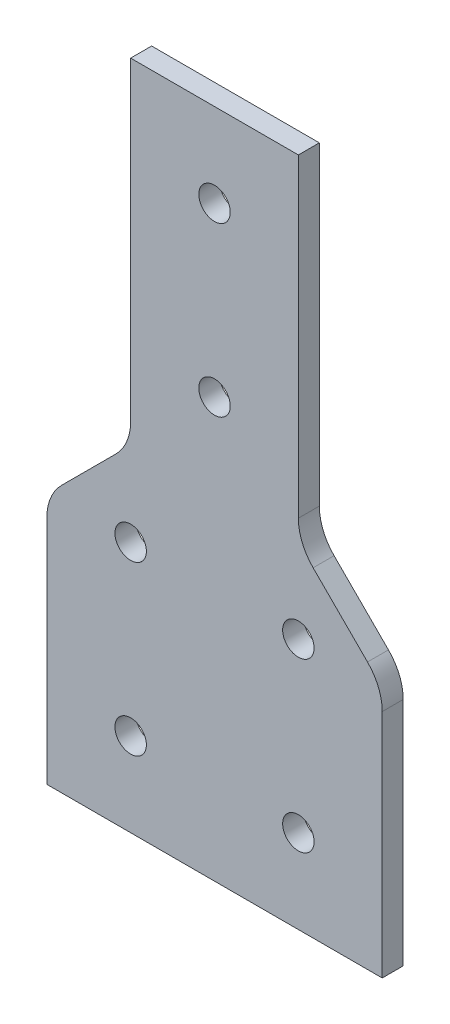
ISO-10303-21;
HEADER;
FILE_DESCRIPTION(('STEP AP214'),'2;1');
FILE_NAME('part.step','',(''),(''),'','','');
FILE_SCHEMA(('AUTOMOTIVE_DESIGN { 1 0 10303 214 1 1 1 1 }'));
ENDSEC;
DATA;
#1=APPLICATION_CONTEXT('core data for automotive mechanical design processes');
#2=APPLICATION_PROTOCOL_DEFINITION('international standard','automotive_design',2000,#1);
#3=PRODUCT_CONTEXT('',#1,'mechanical');
#4=PRODUCT('Part','Part','',(#3));
#5=PRODUCT_RELATED_PRODUCT_CATEGORY('part','',(#4));
#6=PRODUCT_DEFINITION_FORMATION('','',#4);
#7=PRODUCT_DEFINITION_CONTEXT('part definition',#1,'design');
#8=PRODUCT_DEFINITION('design','',#6,#7);
#9=PRODUCT_DEFINITION_SHAPE('','',#8);
#10=(LENGTH_UNIT() NAMED_UNIT(*) SI_UNIT(.MILLI.,.METRE.));
#11=(NAMED_UNIT(*) PLANE_ANGLE_UNIT() SI_UNIT($,.RADIAN.));
#12=(NAMED_UNIT(*) SI_UNIT($,.STERADIAN.) SOLID_ANGLE_UNIT());
#13=UNCERTAINTY_MEASURE_WITH_UNIT(LENGTH_MEASURE(1.E-05),#10,'distance_accuracy_value','');
#14=(GEOMETRIC_REPRESENTATION_CONTEXT(3) GLOBAL_UNCERTAINTY_ASSIGNED_CONTEXT((#13)) GLOBAL_UNIT_ASSIGNED_CONTEXT((#10,
#11,#12)) REPRESENTATION_CONTEXT('',''));
#15=CARTESIAN_POINT('',(0.,0.,0.));
#16=DIRECTION('',(0.,0.,1.));
#17=DIRECTION('',(1.,0.,0.));
#18=AXIS2_PLACEMENT_3D('',#15,#16,#17);
#19=CARTESIAN_POINT('',(12.7,0.,3.175));
#20=DIRECTION('',(1.,0.,0.));
#21=DIRECTION('',(0.,1.,0.));
#22=AXIS2_PLACEMENT_3D('',#19,#20,#21);
#23=PLANE('',#22);
#24=DIRECTION('',(0.,-1.,0.));
#25=VECTOR('',#24,1.);
#26=CARTESIAN_POINT('',(12.7,0.,3.175));
#27=LINE('',#26,#25);
#28=CARTESIAN_POINT('',(12.7,25.4,3.175));
#29=VERTEX_POINT('',#28);
#30=CARTESIAN_POINT('',(12.7,-22.243692654717,3.175));
#31=VERTEX_POINT('',#30);
#32=EDGE_CURVE('E139',#29,#31,#27,.T.);
#33=ORIENTED_EDGE('',*,*,#32,.T.);
#34=DIRECTION('',(0.,0.,1.));
#35=VECTOR('',#34,1.);
#36=CARTESIAN_POINT('',(12.7,-22.243692654717,0.));
#37=LINE('',#36,#35);
#38=CARTESIAN_POINT('',(12.7,-22.243692654717,0.));
#39=VERTEX_POINT('',#38);
#40=EDGE_CURVE('E238',#31,#39,#37,.F.);
#41=ORIENTED_EDGE('',*,*,#40,.T.);
#42=DIRECTION('',(0.,-1.,0.));
#43=VECTOR('',#42,1.);
#44=CARTESIAN_POINT('',(12.7,0.,0.));
#45=LINE('',#44,#43);
#46=CARTESIAN_POINT('',(12.7,25.4,0.));
#47=VERTEX_POINT('',#46);
#48=EDGE_CURVE('E142',#47,#39,#45,.T.);
#49=ORIENTED_EDGE('',*,*,#48,.F.);
#50=DIRECTION('',(0.,0.,-1.));
#51=VECTOR('',#50,1.);
#52=CARTESIAN_POINT('',(12.7,25.4,3.175));
#53=LINE('',#52,#51);
#54=EDGE_CURVE('E136',#29,#47,#53,.T.);
#55=ORIENTED_EDGE('',*,*,#54,.F.);
#56=EDGE_LOOP('',(#33,#41,#49,#55));
#57=FACE_BOUND('',#56,.T.);
#58=ADVANCED_FACE('F45',(#57),#23,.T.);
#59=CARTESIAN_POINT('',(0.,25.4,3.175));
#60=DIRECTION('',(0.,1.,0.));
#61=DIRECTION('',(0.,0.,1.));
#62=AXIS2_PLACEMENT_3D('',#59,#60,#61);
#63=PLANE('',#62);
#64=DIRECTION('',(1.,0.,0.));
#65=VECTOR('',#64,1.);
#66=CARTESIAN_POINT('',(0.,25.4,0.));
#67=LINE('',#66,#65);
#68=CARTESIAN_POINT('',(-12.7,25.4,0.));
#69=VERTEX_POINT('',#68);
#70=EDGE_CURVE('E210',#69,#47,#67,.T.);
#71=ORIENTED_EDGE('',*,*,#70,.F.);
#72=DIRECTION('',(0.,0.,-1.));
#73=VECTOR('',#72,1.);
#74=CARTESIAN_POINT('',(-12.7,25.4,3.175));
#75=LINE('',#74,#73);
#76=CARTESIAN_POINT('',(-12.7,25.4,3.175));
#77=VERTEX_POINT('',#76);
#78=EDGE_CURVE('E148',#77,#69,#75,.T.);
#79=ORIENTED_EDGE('',*,*,#78,.F.);
#80=DIRECTION('',(1.,0.,0.));
#81=VECTOR('',#80,1.);
#82=CARTESIAN_POINT('',(0.,25.4,3.175));
#83=LINE('',#82,#81);
#84=EDGE_CURVE('E155',#77,#29,#83,.T.);
#85=ORIENTED_EDGE('',*,*,#84,.T.);
#86=ORIENTED_EDGE('',*,*,#54,.T.);
#87=EDGE_LOOP('',(#71,#79,#85,#86));
#88=FACE_BOUND('',#87,.T.);
#89=ADVANCED_FACE('F162',(#88),#63,.T.);
#90=CARTESIAN_POINT('',(-12.7,0.,3.175));
#91=DIRECTION('',(1.,0.,0.));
#92=DIRECTION('',(0.,1.,0.));
#93=AXIS2_PLACEMENT_3D('',#90,#91,#92);
#94=PLANE('',#93);
#95=DIRECTION('',(0.,-1.,0.));
#96=VECTOR('',#95,1.);
#97=CARTESIAN_POINT('',(-12.7,0.,0.));
#98=LINE('',#97,#96);
#99=CARTESIAN_POINT('',(-12.7,-22.2436926547171,0.));
#100=VERTEX_POINT('',#99);
#101=EDGE_CURVE('E213',#69,#100,#98,.T.);
#102=ORIENTED_EDGE('',*,*,#101,.T.);
#103=DIRECTION('',(0.,0.,-1.));
#104=VECTOR('',#103,1.);
#105=CARTESIAN_POINT('',(-12.7,-22.2436926547171,3.175));
#106=LINE('',#105,#104);
#107=CARTESIAN_POINT('',(-12.7,-22.2436926547171,3.175));
#108=VERTEX_POINT('',#107);
#109=EDGE_CURVE('E249',#100,#108,#106,.F.);
#110=ORIENTED_EDGE('',*,*,#109,.T.);
#111=DIRECTION('',(0.,-1.,0.));
#112=VECTOR('',#111,1.);
#113=CARTESIAN_POINT('',(-12.7,0.,3.175));
#114=LINE('',#113,#112);
#115=EDGE_CURVE('E165',#77,#108,#114,.T.);
#116=ORIENTED_EDGE('',*,*,#115,.F.);
#117=ORIENTED_EDGE('',*,*,#78,.T.);
#118=EDGE_LOOP('',(#102,#110,#116,#117));
#119=FACE_BOUND('',#118,.T.);
#120=ADVANCED_FACE('F286',(#119),#94,.F.);
#121=CARTESIAN_POINT('',(-25.4,0.,3.175));
#122=DIRECTION('',(1.,0.,0.));
#123=DIRECTION('',(0.,1.,0.));
#124=AXIS2_PLACEMENT_3D('',#121,#122,#123);
#125=PLANE('',#124);
#126=DIRECTION('',(0.,-1.,0.));
#127=VECTOR('',#126,1.);
#128=CARTESIAN_POINT('',(-25.4,0.,3.175));
#129=LINE('',#128,#127);
#130=CARTESIAN_POINT('',(-25.4,-41.256307345283,3.175));
#131=VERTEX_POINT('',#130);
#132=CARTESIAN_POINT('',(-25.4,-76.2,3.175));
#133=VERTEX_POINT('',#132);
#134=EDGE_CURVE('E168',#131,#133,#129,.T.);
#135=ORIENTED_EDGE('',*,*,#134,.F.);
#136=DIRECTION('',(0.,0.,-1.));
#137=VECTOR('',#136,1.);
#138=CARTESIAN_POINT('',(-25.4,-41.256307345283,0.));
#139=LINE('',#138,#137);
#140=CARTESIAN_POINT('',(-25.4,-41.256307345283,0.));
#141=VERTEX_POINT('',#140);
#142=EDGE_CURVE('E251',#131,#141,#139,.T.);
#143=ORIENTED_EDGE('',*,*,#142,.T.);
#144=DIRECTION('',(0.,-1.,0.));
#145=VECTOR('',#144,1.);
#146=CARTESIAN_POINT('',(-25.4,0.,0.));
#147=LINE('',#146,#145);
#148=CARTESIAN_POINT('',(-25.4,-76.2,0.));
#149=VERTEX_POINT('',#148);
#150=EDGE_CURVE('E216',#141,#149,#147,.T.);
#151=ORIENTED_EDGE('',*,*,#150,.T.);
#152=DIRECTION('',(0.,0.,-1.));
#153=VECTOR('',#152,1.);
#154=CARTESIAN_POINT('',(-25.4,-76.2,3.175));
#155=LINE('',#154,#153);
#156=EDGE_CURVE('E224',#133,#149,#155,.T.);
#157=ORIENTED_EDGE('',*,*,#156,.F.);
#158=EDGE_LOOP('',(#135,#143,#151,#157));
#159=FACE_BOUND('',#158,.T.);
#160=ADVANCED_FACE('F269',(#159),#125,.F.);
#161=CARTESIAN_POINT('',(0.,-76.2,3.175));
#162=DIRECTION('',(0.,1.,0.));
#163=DIRECTION('',(0.,0.,1.));
#164=AXIS2_PLACEMENT_3D('',#161,#162,#163);
#165=PLANE('',#164);
#166=DIRECTION('',(1.,0.,0.));
#167=VECTOR('',#166,1.);
#168=CARTESIAN_POINT('',(0.,-76.2,0.));
#169=LINE('',#168,#167);
#170=CARTESIAN_POINT('',(25.4,-76.2,0.));
#171=VERTEX_POINT('',#170);
#172=EDGE_CURVE('E218',#149,#171,#169,.T.);
#173=ORIENTED_EDGE('',*,*,#172,.T.);
#174=DIRECTION('',(0.,0.,-1.));
#175=VECTOR('',#174,1.);
#176=CARTESIAN_POINT('',(25.4,-76.2,3.175));
#177=LINE('',#176,#175);
#178=CARTESIAN_POINT('',(25.4,-76.2,3.175));
#179=VERTEX_POINT('',#178);
#180=EDGE_CURVE('E208',#179,#171,#177,.T.);
#181=ORIENTED_EDGE('',*,*,#180,.F.);
#182=DIRECTION('',(1.,0.,0.));
#183=VECTOR('',#182,1.);
#184=CARTESIAN_POINT('',(0.,-76.2,3.175));
#185=LINE('',#184,#183);
#186=EDGE_CURVE('E200',#133,#179,#185,.T.);
#187=ORIENTED_EDGE('',*,*,#186,.F.);
#188=ORIENTED_EDGE('',*,*,#156,.T.);
#189=EDGE_LOOP('',(#173,#181,#187,#188));
#190=FACE_BOUND('',#189,.T.);
#191=ADVANCED_FACE('F273',(#190),#165,.F.);
#192=CARTESIAN_POINT('',(25.4,0.,3.175));
#193=DIRECTION('',(1.,0.,0.));
#194=DIRECTION('',(0.,1.,0.));
#195=AXIS2_PLACEMENT_3D('',#192,#193,#194);
#196=PLANE('',#195);
#197=DIRECTION('',(0.,-1.,0.));
#198=VECTOR('',#197,1.);
#199=CARTESIAN_POINT('',(25.4,0.,0.));
#200=LINE('',#199,#198);
#201=CARTESIAN_POINT('',(25.4,-41.256307345283,0.));
#202=VERTEX_POINT('',#201);
#203=EDGE_CURVE('E160',#202,#171,#200,.T.);
#204=ORIENTED_EDGE('',*,*,#203,.F.);
#205=DIRECTION('',(0.,0.,-1.));
#206=VECTOR('',#205,1.);
#207=CARTESIAN_POINT('',(25.4,-41.256307345283,3.175));
#208=LINE('',#207,#206);
#209=CARTESIAN_POINT('',(25.4,-41.256307345283,3.175));
#210=VERTEX_POINT('',#209);
#211=EDGE_CURVE('E190',#202,#210,#208,.F.);
#212=ORIENTED_EDGE('',*,*,#211,.T.);
#213=DIRECTION('',(0.,-1.,0.));
#214=VECTOR('',#213,1.);
#215=CARTESIAN_POINT('',(25.4,0.,3.175));
#216=LINE('',#215,#214);
#217=EDGE_CURVE('E204',#210,#179,#216,.T.);
#218=ORIENTED_EDGE('',*,*,#217,.T.);
#219=ORIENTED_EDGE('',*,*,#180,.T.);
#220=EDGE_LOOP('',(#204,#212,#218,#219));
#221=FACE_BOUND('',#220,.T.);
#222=ADVANCED_FACE('F277',(#221),#196,.T.);
#223=CARTESIAN_POINT('',(0.,0.,3.175));
#224=DIRECTION('',(0.,0.,1.));
#225=DIRECTION('',(1.,0.,0.));
#226=AXIS2_PLACEMENT_3D('',#223,#224,#225);
#227=PLANE('',#226);
#228=CARTESIAN_POINT('',(0.,12.7,3.175));
#229=DIRECTION('',(0.,0.,1.));
#230=DIRECTION('',(1.,0.,0.));
#231=AXIS2_PLACEMENT_3D('',#228,#229,#230);
#232=CIRCLE('',#231,2.38125);
#233=CARTESIAN_POINT('',(2.38125,12.7,3.175));
#234=VERTEX_POINT('',#233);
#235=EDGE_CURVE('E545',#234,#234,#232,.T.);
#236=ORIENTED_EDGE('',*,*,#235,.F.);
#237=EDGE_LOOP('',(#236));
#238=FACE_BOUND('',#237,.T.);
#239=CARTESIAN_POINT('',(12.7,-38.1,3.175));
#240=DIRECTION('',(0.,0.,1.));
#241=DIRECTION('',(-1.,0.,0.));
#242=AXIS2_PLACEMENT_3D('',#239,#240,#241);
#243=CIRCLE('',#242,2.38125);
#244=CARTESIAN_POINT('',(10.31875,-38.1,3.175));
#245=VERTEX_POINT('',#244);
#246=EDGE_CURVE('E549',#245,#245,#243,.T.);
#247=ORIENTED_EDGE('',*,*,#246,.F.);
#248=EDGE_LOOP('',(#247));
#249=FACE_BOUND('',#248,.T.);
#250=CARTESIAN_POINT('',(12.7,-63.5,3.175));
#251=DIRECTION('',(0.,0.,1.));
#252=DIRECTION('',(-1.,0.,0.));
#253=AXIS2_PLACEMENT_3D('',#250,#251,#252);
#254=CIRCLE('',#253,2.38125);
#255=CARTESIAN_POINT('',(10.31875,-63.5,3.175));
#256=VERTEX_POINT('',#255);
#257=EDGE_CURVE('E560',#256,#256,#254,.T.);
#258=ORIENTED_EDGE('',*,*,#257,.F.);
#259=EDGE_LOOP('',(#258));
#260=FACE_BOUND('',#259,.T.);
#261=CARTESIAN_POINT('',(-12.7,-63.5,3.175));
#262=DIRECTION('',(0.,0.,1.));
#263=DIRECTION('',(1.,0.,0.));
#264=AXIS2_PLACEMENT_3D('',#261,#262,#263);
#265=CIRCLE('',#264,2.38125);
#266=CARTESIAN_POINT('',(-10.31875,-63.5,3.175));
#267=VERTEX_POINT('',#266);
#268=EDGE_CURVE('E534',#267,#267,#265,.T.);
#269=ORIENTED_EDGE('',*,*,#268,.F.);
#270=EDGE_LOOP('',(#269));
#271=FACE_BOUND('',#270,.T.);
#272=CARTESIAN_POINT('',(-12.7,-38.1,3.175));
#273=DIRECTION('',(0.,0.,1.));
#274=DIRECTION('',(1.,0.,0.));
#275=AXIS2_PLACEMENT_3D('',#272,#273,#274);
#276=CIRCLE('',#275,2.38125);
#277=CARTESIAN_POINT('',(-10.31875,-38.1,3.175));
#278=VERTEX_POINT('',#277);
#279=EDGE_CURVE('E524',#278,#278,#276,.T.);
#280=ORIENTED_EDGE('',*,*,#279,.F.);
#281=EDGE_LOOP('',(#280));
#282=FACE_BOUND('',#281,.T.);
#283=CARTESIAN_POINT('',(0.,-12.7,3.175));
#284=DIRECTION('',(0.,0.,1.));
#285=DIRECTION('',(1.,0.,0.));
#286=AXIS2_PLACEMENT_3D('',#283,#284,#285);
#287=CIRCLE('',#286,2.38125);
#288=CARTESIAN_POINT('',(2.38125,-12.7,3.175));
#289=VERTEX_POINT('',#288);
#290=EDGE_CURVE('E532',#289,#289,#287,.T.);
#291=ORIENTED_EDGE('',*,*,#290,.F.);
#292=EDGE_LOOP('',(#291));
#293=FACE_BOUND('',#292,.T.);
#294=DIRECTION('',(-0.707106781186549,-0.707106781186546,0.));
#295=VECTOR('',#294,1.);
#296=CARTESIAN_POINT('',(6.35000000000006,-6.35000000000008,3.175));
#297=LINE('',#296,#295);
#298=CARTESIAN_POINT('',(-14.9318463273585,-27.6318463273586,3.175));
#299=VERTEX_POINT('',#298);
#300=CARTESIAN_POINT('',(-23.1681536726415,-35.8681536726415,3.175));
#301=VERTEX_POINT('',#300);
#302=EDGE_CURVE('E234',#299,#301,#297,.T.);
#303=ORIENTED_EDGE('',*,*,#302,.T.);
#304=CARTESIAN_POINT('',(-17.78,-41.256307345283,3.175));
#305=DIRECTION('',(0.,0.,1.));
#306=DIRECTION('',(1.,0.,0.));
#307=AXIS2_PLACEMENT_3D('',#304,#305,#306);
#308=CIRCLE('',#307,7.62);
#309=EDGE_CURVE('E184',#301,#131,#308,.T.);
#310=ORIENTED_EDGE('',*,*,#309,.T.);
#311=ORIENTED_EDGE('',*,*,#134,.T.);
#312=ORIENTED_EDGE('',*,*,#186,.T.);
#313=ORIENTED_EDGE('',*,*,#217,.F.);
#314=CARTESIAN_POINT('',(17.78,-41.256307345283,3.175));
#315=DIRECTION('',(0.,0.,1.));
#316=DIRECTION('',(1.,0.,0.));
#317=AXIS2_PLACEMENT_3D('',#314,#315,#316);
#318=CIRCLE('',#317,7.62);
#319=CARTESIAN_POINT('',(23.1681536726415,-35.8681536726415,3.175));
#320=VERTEX_POINT('',#319);
#321=EDGE_CURVE('E61',#210,#320,#318,.T.);
#322=ORIENTED_EDGE('',*,*,#321,.T.);
#323=DIRECTION('',(0.707106781186546,-0.707106781186549,0.));
#324=VECTOR('',#323,1.);
#325=CARTESIAN_POINT('',(-6.34999999999997,-6.34999999999995,3.175));
#326=LINE('',#325,#324);
#327=CARTESIAN_POINT('',(14.9318463273585,-27.6318463273585,3.175));
#328=VERTEX_POINT('',#327);
#329=EDGE_CURVE('E232',#320,#328,#326,.F.);
#330=ORIENTED_EDGE('',*,*,#329,.T.);
#331=CARTESIAN_POINT('',(20.32,-22.243692654717,3.175));
#332=DIRECTION('',(0.,0.,1.));
#333=DIRECTION('',(1.,0.,0.));
#334=AXIS2_PLACEMENT_3D('',#331,#332,#333);
#335=CIRCLE('',#334,7.62);
#336=EDGE_CURVE('E158',#328,#31,#335,.F.);
#337=ORIENTED_EDGE('',*,*,#336,.T.);
#338=ORIENTED_EDGE('',*,*,#32,.F.);
#339=ORIENTED_EDGE('',*,*,#84,.F.);
#340=ORIENTED_EDGE('',*,*,#115,.T.);
#341=CARTESIAN_POINT('',(-20.32,-22.2436926547171,3.175));
#342=DIRECTION('',(0.,0.,1.));
#343=DIRECTION('',(1.,0.,0.));
#344=AXIS2_PLACEMENT_3D('',#341,#342,#343);
#345=CIRCLE('',#344,7.62);
#346=EDGE_CURVE('E12',#108,#299,#345,.F.);
#347=ORIENTED_EDGE('',*,*,#346,.T.);
#348=EDGE_LOOP('',(#303,#310,#311,#312,#313,#322,#330,#337,#338,#339,#340,#347));
#349=FACE_BOUND('',#348,.T.);
#350=ADVANCED_FACE('F153',(#238,#249,#260,#271,#282,#293,#349),#227,.T.);
#351=CARTESIAN_POINT('',(0.,0.,0.));
#352=DIRECTION('',(0.,0.,1.));
#353=DIRECTION('',(1.,0.,0.));
#354=AXIS2_PLACEMENT_3D('',#351,#352,#353);
#355=PLANE('',#354);
#356=CARTESIAN_POINT('',(0.,12.7,0.));
#357=DIRECTION('',(0.,0.,1.));
#358=DIRECTION('',(1.,0.,0.));
#359=AXIS2_PLACEMENT_3D('',#356,#357,#358);
#360=CIRCLE('',#359,2.38125);
#361=CARTESIAN_POINT('',(2.38125,12.7,0.));
#362=VERTEX_POINT('',#361);
#363=EDGE_CURVE('E211',#362,#362,#360,.T.);
#364=ORIENTED_EDGE('',*,*,#363,.T.);
#365=EDGE_LOOP('',(#364));
#366=FACE_BOUND('',#365,.T.);
#367=CARTESIAN_POINT('',(12.7,-38.1,0.));
#368=DIRECTION('',(0.,0.,1.));
#369=DIRECTION('',(-1.,0.,0.));
#370=AXIS2_PLACEMENT_3D('',#367,#368,#369);
#371=CIRCLE('',#370,2.38125);
#372=CARTESIAN_POINT('',(10.31875,-38.1,0.));
#373=VERTEX_POINT('',#372);
#374=EDGE_CURVE('E546',#373,#373,#371,.T.);
#375=ORIENTED_EDGE('',*,*,#374,.T.);
#376=EDGE_LOOP('',(#375));
#377=FACE_BOUND('',#376,.T.);
#378=CARTESIAN_POINT('',(12.7,-63.5,0.));
#379=DIRECTION('',(0.,0.,1.));
#380=DIRECTION('',(-1.,0.,0.));
#381=AXIS2_PLACEMENT_3D('',#378,#379,#380);
#382=CIRCLE('',#381,2.38125);
#383=CARTESIAN_POINT('',(10.31875,-63.5,0.));
#384=VERTEX_POINT('',#383);
#385=EDGE_CURVE('E554',#384,#384,#382,.T.);
#386=ORIENTED_EDGE('',*,*,#385,.T.);
#387=EDGE_LOOP('',(#386));
#388=FACE_BOUND('',#387,.T.);
#389=CARTESIAN_POINT('',(-12.7,-63.5,0.));
#390=DIRECTION('',(0.,0.,1.));
#391=DIRECTION('',(1.,0.,0.));
#392=AXIS2_PLACEMENT_3D('',#389,#390,#391);
#393=CIRCLE('',#392,2.38125);
#394=CARTESIAN_POINT('',(-10.31875,-63.5,0.));
#395=VERTEX_POINT('',#394);
#396=EDGE_CURVE('E565',#395,#395,#393,.T.);
#397=ORIENTED_EDGE('',*,*,#396,.T.);
#398=EDGE_LOOP('',(#397));
#399=FACE_BOUND('',#398,.T.);
#400=CARTESIAN_POINT('',(-12.7,-38.1,0.));
#401=DIRECTION('',(0.,0.,1.));
#402=DIRECTION('',(1.,0.,0.));
#403=AXIS2_PLACEMENT_3D('',#400,#401,#402);
#404=CIRCLE('',#403,2.38125);
#405=CARTESIAN_POINT('',(-10.31875,-38.1,0.));
#406=VERTEX_POINT('',#405);
#407=EDGE_CURVE('E521',#406,#406,#404,.T.);
#408=ORIENTED_EDGE('',*,*,#407,.T.);
#409=EDGE_LOOP('',(#408));
#410=FACE_BOUND('',#409,.T.);
#411=CARTESIAN_POINT('',(0.,-12.7,0.));
#412=DIRECTION('',(0.,0.,1.));
#413=DIRECTION('',(1.,0.,0.));
#414=AXIS2_PLACEMENT_3D('',#411,#412,#413);
#415=CIRCLE('',#414,2.38125);
#416=CARTESIAN_POINT('',(2.38125,-12.7,0.));
#417=VERTEX_POINT('',#416);
#418=EDGE_CURVE('E527',#417,#417,#415,.T.);
#419=ORIENTED_EDGE('',*,*,#418,.T.);
#420=EDGE_LOOP('',(#419));
#421=FACE_BOUND('',#420,.T.);
#422=ORIENTED_EDGE('',*,*,#150,.F.);
#423=CARTESIAN_POINT('',(-17.78,-41.256307345283,0.));
#424=DIRECTION('',(0.,0.,1.));
#425=DIRECTION('',(1.,0.,0.));
#426=AXIS2_PLACEMENT_3D('',#423,#424,#425);
#427=CIRCLE('',#426,7.62);
#428=CARTESIAN_POINT('',(-23.1681536726415,-35.8681536726415,0.));
#429=VERTEX_POINT('',#428);
#430=EDGE_CURVE('E185',#141,#429,#427,.F.);
#431=ORIENTED_EDGE('',*,*,#430,.T.);
#432=DIRECTION('',(0.707106781186549,0.707106781186546,0.));
#433=VECTOR('',#432,1.);
#434=CARTESIAN_POINT('',(-25.4,-38.1,0.));
#435=LINE('',#434,#433);
#436=CARTESIAN_POINT('',(-14.9318463273585,-27.6318463273586,0.));
#437=VERTEX_POINT('',#436);
#438=EDGE_CURVE('E229',#429,#437,#435,.T.);
#439=ORIENTED_EDGE('',*,*,#438,.T.);
#440=CARTESIAN_POINT('',(-20.32,-22.2436926547171,0.));
#441=DIRECTION('',(0.,0.,1.));
#442=DIRECTION('',(1.,0.,0.));
#443=AXIS2_PLACEMENT_3D('',#440,#441,#442);
#444=CIRCLE('',#443,7.62);
#445=EDGE_CURVE('E54',#437,#100,#444,.T.);
#446=ORIENTED_EDGE('',*,*,#445,.T.);
#447=ORIENTED_EDGE('',*,*,#101,.F.);
#448=ORIENTED_EDGE('',*,*,#70,.T.);
#449=ORIENTED_EDGE('',*,*,#48,.T.);
#450=CARTESIAN_POINT('',(20.32,-22.243692654717,0.));
#451=DIRECTION('',(0.,0.,1.));
#452=DIRECTION('',(1.,0.,0.));
#453=AXIS2_PLACEMENT_3D('',#450,#451,#452);
#454=CIRCLE('',#453,7.62);
#455=CARTESIAN_POINT('',(14.9318463273585,-27.6318463273585,0.));
#456=VERTEX_POINT('',#455);
#457=EDGE_CURVE('E278',#39,#456,#454,.T.);
#458=ORIENTED_EDGE('',*,*,#457,.T.);
#459=DIRECTION('',(-0.707106781186546,0.707106781186549,0.));
#460=VECTOR('',#459,1.);
#461=CARTESIAN_POINT('',(12.7,-25.4,0.));
#462=LINE('',#461,#460);
#463=CARTESIAN_POINT('',(23.1681536726415,-35.8681536726415,0.));
#464=VERTEX_POINT('',#463);
#465=EDGE_CURVE('E147',#456,#464,#462,.F.);
#466=ORIENTED_EDGE('',*,*,#465,.T.);
#467=CARTESIAN_POINT('',(17.78,-41.256307345283,0.));
#468=DIRECTION('',(0.,0.,1.));
#469=DIRECTION('',(1.,0.,0.));
#470=AXIS2_PLACEMENT_3D('',#467,#468,#469);
#471=CIRCLE('',#470,7.62);
#472=EDGE_CURVE('E69',#464,#202,#471,.F.);
#473=ORIENTED_EDGE('',*,*,#472,.T.);
#474=ORIENTED_EDGE('',*,*,#203,.T.);
#475=ORIENTED_EDGE('',*,*,#172,.F.);
#476=EDGE_LOOP('',(#422,#431,#439,#446,#447,#448,#449,#458,#466,#473,#474,#475));
#477=FACE_BOUND('',#476,.T.);
#478=ADVANCED_FACE('F255',(#366,#377,#388,#399,#410,#421,#477),#355,.F.);
#479=CARTESIAN_POINT('',(-25.4,-38.1,3.175));
#480=DIRECTION('',(-0.707106781186546,0.707106781186549,0.));
#481=DIRECTION('',(0.,0.,1.));
#482=AXIS2_PLACEMENT_3D('',#479,#480,#481);
#483=PLANE('',#482);
#484=ORIENTED_EDGE('',*,*,#302,.F.);
#485=DIRECTION('',(0.,0.,-1.));
#486=VECTOR('',#485,1.);
#487=CARTESIAN_POINT('',(-14.9318463273585,-27.6318463273586,3.175));
#488=LINE('',#487,#486);
#489=EDGE_CURVE('E246',#299,#437,#488,.T.);
#490=ORIENTED_EDGE('',*,*,#489,.T.);
#491=ORIENTED_EDGE('',*,*,#438,.F.);
#492=DIRECTION('',(0.,0.,-1.));
#493=VECTOR('',#492,1.);
#494=CARTESIAN_POINT('',(-23.1681536726415,-35.8681536726415,3.175));
#495=LINE('',#494,#493);
#496=EDGE_CURVE('E244',#429,#301,#495,.F.);
#497=ORIENTED_EDGE('',*,*,#496,.T.);
#498=EDGE_LOOP('',(#484,#490,#491,#497));
#499=FACE_BOUND('',#498,.T.);
#500=ADVANCED_FACE('F262',(#499),#483,.T.);
#501=CARTESIAN_POINT('',(12.7,-25.4,3.175));
#502=DIRECTION('',(-0.707106781186549,-0.707106781186546,0.));
#503=DIRECTION('',(0.,0.,-1.));
#504=AXIS2_PLACEMENT_3D('',#501,#502,#503);
#505=PLANE('',#504);
#506=ORIENTED_EDGE('',*,*,#465,.F.);
#507=DIRECTION('',(0.,0.,-1.));
#508=VECTOR('',#507,1.);
#509=CARTESIAN_POINT('',(14.9318463273585,-27.6318463273585,3.175));
#510=LINE('',#509,#508);
#511=EDGE_CURVE('E242',#456,#328,#510,.F.);
#512=ORIENTED_EDGE('',*,*,#511,.T.);
#513=ORIENTED_EDGE('',*,*,#329,.F.);
#514=DIRECTION('',(0.,0.,1.));
#515=VECTOR('',#514,1.);
#516=CARTESIAN_POINT('',(23.1681536726415,-35.8681536726415,3.175));
#517=LINE('',#516,#515);
#518=EDGE_CURVE('E240',#320,#464,#517,.F.);
#519=ORIENTED_EDGE('',*,*,#518,.T.);
#520=EDGE_LOOP('',(#506,#512,#513,#519));
#521=FACE_BOUND('',#520,.T.);
#522=ADVANCED_FACE('F313',(#521),#505,.F.);
#523=CARTESIAN_POINT('',(0.,-12.7,0.));
#524=DIRECTION('',(0.,0.,1.));
#525=DIRECTION('',(1.,0.,0.));
#526=AXIS2_PLACEMENT_3D('',#523,#524,#525);
#527=CYLINDRICAL_SURFACE('',#526,2.38125);
#528=ORIENTED_EDGE('',*,*,#418,.F.);
#529=EDGE_LOOP('',(#528));
#530=FACE_BOUND('',#529,.T.);
#531=ORIENTED_EDGE('',*,*,#290,.T.);
#532=EDGE_LOOP('',(#531));
#533=FACE_BOUND('',#532,.T.);
#534=ADVANCED_FACE('F317',(#530,#533),#527,.F.);
#535=CARTESIAN_POINT('',(-12.7,-38.1,0.));
#536=DIRECTION('',(0.,0.,1.));
#537=DIRECTION('',(1.,0.,0.));
#538=AXIS2_PLACEMENT_3D('',#535,#536,#537);
#539=CYLINDRICAL_SURFACE('',#538,2.38125);
#540=ORIENTED_EDGE('',*,*,#407,.F.);
#541=EDGE_LOOP('',(#540));
#542=FACE_BOUND('',#541,.T.);
#543=ORIENTED_EDGE('',*,*,#279,.T.);
#544=EDGE_LOOP('',(#543));
#545=FACE_BOUND('',#544,.T.);
#546=ADVANCED_FACE('F322',(#542,#545),#539,.F.);
#547=CARTESIAN_POINT('',(-12.7,-63.5,0.));
#548=DIRECTION('',(0.,0.,1.));
#549=DIRECTION('',(1.,0.,0.));
#550=AXIS2_PLACEMENT_3D('',#547,#548,#549);
#551=CYLINDRICAL_SURFACE('',#550,2.38125);
#552=ORIENTED_EDGE('',*,*,#396,.F.);
#553=EDGE_LOOP('',(#552));
#554=FACE_BOUND('',#553,.T.);
#555=ORIENTED_EDGE('',*,*,#268,.T.);
#556=EDGE_LOOP('',(#555));
#557=FACE_BOUND('',#556,.T.);
#558=ADVANCED_FACE('F444',(#554,#557),#551,.F.);
#559=CARTESIAN_POINT('',(12.7,-63.5,0.));
#560=DIRECTION('',(0.,0.,1.));
#561=DIRECTION('',(1.,0.,0.));
#562=AXIS2_PLACEMENT_3D('',#559,#560,#561);
#563=CYLINDRICAL_SURFACE('',#562,2.38125);
#564=ORIENTED_EDGE('',*,*,#385,.F.);
#565=EDGE_LOOP('',(#564));
#566=FACE_BOUND('',#565,.T.);
#567=ORIENTED_EDGE('',*,*,#257,.T.);
#568=EDGE_LOOP('',(#567));
#569=FACE_BOUND('',#568,.T.);
#570=ADVANCED_FACE('F433',(#566,#569),#563,.F.);
#571=CARTESIAN_POINT('',(12.7,-38.1,0.));
#572=DIRECTION('',(0.,0.,1.));
#573=DIRECTION('',(1.,0.,0.));
#574=AXIS2_PLACEMENT_3D('',#571,#572,#573);
#575=CYLINDRICAL_SURFACE('',#574,2.38125);
#576=ORIENTED_EDGE('',*,*,#374,.F.);
#577=EDGE_LOOP('',(#576));
#578=FACE_BOUND('',#577,.T.);
#579=ORIENTED_EDGE('',*,*,#246,.T.);
#580=EDGE_LOOP('',(#579));
#581=FACE_BOUND('',#580,.T.);
#582=ADVANCED_FACE('F422',(#578,#581),#575,.F.);
#583=CARTESIAN_POINT('',(0.,12.7,0.));
#584=DIRECTION('',(0.,0.,1.));
#585=DIRECTION('',(1.,0.,0.));
#586=AXIS2_PLACEMENT_3D('',#583,#584,#585);
#587=CYLINDRICAL_SURFACE('',#586,2.38125);
#588=ORIENTED_EDGE('',*,*,#363,.F.);
#589=EDGE_LOOP('',(#588));
#590=FACE_BOUND('',#589,.T.);
#591=ORIENTED_EDGE('',*,*,#235,.T.);
#592=EDGE_LOOP('',(#591));
#593=FACE_BOUND('',#592,.T.);
#594=ADVANCED_FACE('F296',(#590,#593),#587,.F.);
#595=CARTESIAN_POINT('',(20.32,-22.243692654717,3.175));
#596=DIRECTION('',(0.,0.,-1.));
#597=DIRECTION('',(-1.,0.,0.));
#598=AXIS2_PLACEMENT_3D('',#595,#596,#597);
#599=CYLINDRICAL_SURFACE('',#598,7.62);
#600=ORIENTED_EDGE('',*,*,#336,.F.);
#601=ORIENTED_EDGE('',*,*,#511,.F.);
#602=ORIENTED_EDGE('',*,*,#457,.F.);
#603=ORIENTED_EDGE('',*,*,#40,.F.);
#604=EDGE_LOOP('',(#600,#601,#602,#603));
#605=FACE_BOUND('',#604,.T.);
#606=ADVANCED_FACE('F290',(#605),#599,.F.);
#607=CARTESIAN_POINT('',(-20.32,-22.2436926547171,3.175));
#608=DIRECTION('',(0.,0.,-1.));
#609=DIRECTION('',(-1.,0.,0.));
#610=AXIS2_PLACEMENT_3D('',#607,#608,#609);
#611=CYLINDRICAL_SURFACE('',#610,7.62);
#612=ORIENTED_EDGE('',*,*,#346,.F.);
#613=ORIENTED_EDGE('',*,*,#109,.F.);
#614=ORIENTED_EDGE('',*,*,#445,.F.);
#615=ORIENTED_EDGE('',*,*,#489,.F.);
#616=EDGE_LOOP('',(#612,#613,#614,#615));
#617=FACE_BOUND('',#616,.T.);
#618=ADVANCED_FACE('F288',(#617),#611,.F.);
#619=CARTESIAN_POINT('',(-17.78,-41.256307345283,3.175));
#620=DIRECTION('',(0.,0.,1.));
#621=DIRECTION('',(1.,0.,0.));
#622=AXIS2_PLACEMENT_3D('',#619,#620,#621);
#623=CYLINDRICAL_SURFACE('',#622,7.62);
#624=ORIENTED_EDGE('',*,*,#309,.F.);
#625=ORIENTED_EDGE('',*,*,#496,.F.);
#626=ORIENTED_EDGE('',*,*,#430,.F.);
#627=ORIENTED_EDGE('',*,*,#142,.F.);
#628=EDGE_LOOP('',(#624,#625,#626,#627));
#629=FACE_BOUND('',#628,.T.);
#630=ADVANCED_FACE('F265',(#629),#623,.T.);
#631=CARTESIAN_POINT('',(17.78,-41.256307345283,3.175));
#632=DIRECTION('',(0.,0.,-1.));
#633=DIRECTION('',(-1.,0.,0.));
#634=AXIS2_PLACEMENT_3D('',#631,#632,#633);
#635=CYLINDRICAL_SURFACE('',#634,7.62);
#636=ORIENTED_EDGE('',*,*,#472,.F.);
#637=ORIENTED_EDGE('',*,*,#518,.F.);
#638=ORIENTED_EDGE('',*,*,#321,.F.);
#639=ORIENTED_EDGE('',*,*,#211,.F.);
#640=EDGE_LOOP('',(#636,#637,#638,#639));
#641=FACE_BOUND('',#640,.T.);
#642=ADVANCED_FACE('F47',(#641),#635,.T.);
#643=CLOSED_SHELL('',(#58,#89,#120,#160,#191,#222,#350,#478,#500,#522,#534,#546,#558,#570,#582,
#594,#606,#618,#630,#642));
#644=MANIFOLD_SOLID_BREP('B2',#643);
#645=ADVANCED_BREP_SHAPE_REPRESENTATION('',(#18,#644),#14);
#646=SHAPE_DEFINITION_REPRESENTATION(#9,#645);
ENDSEC;
END-ISO-10303-21;
